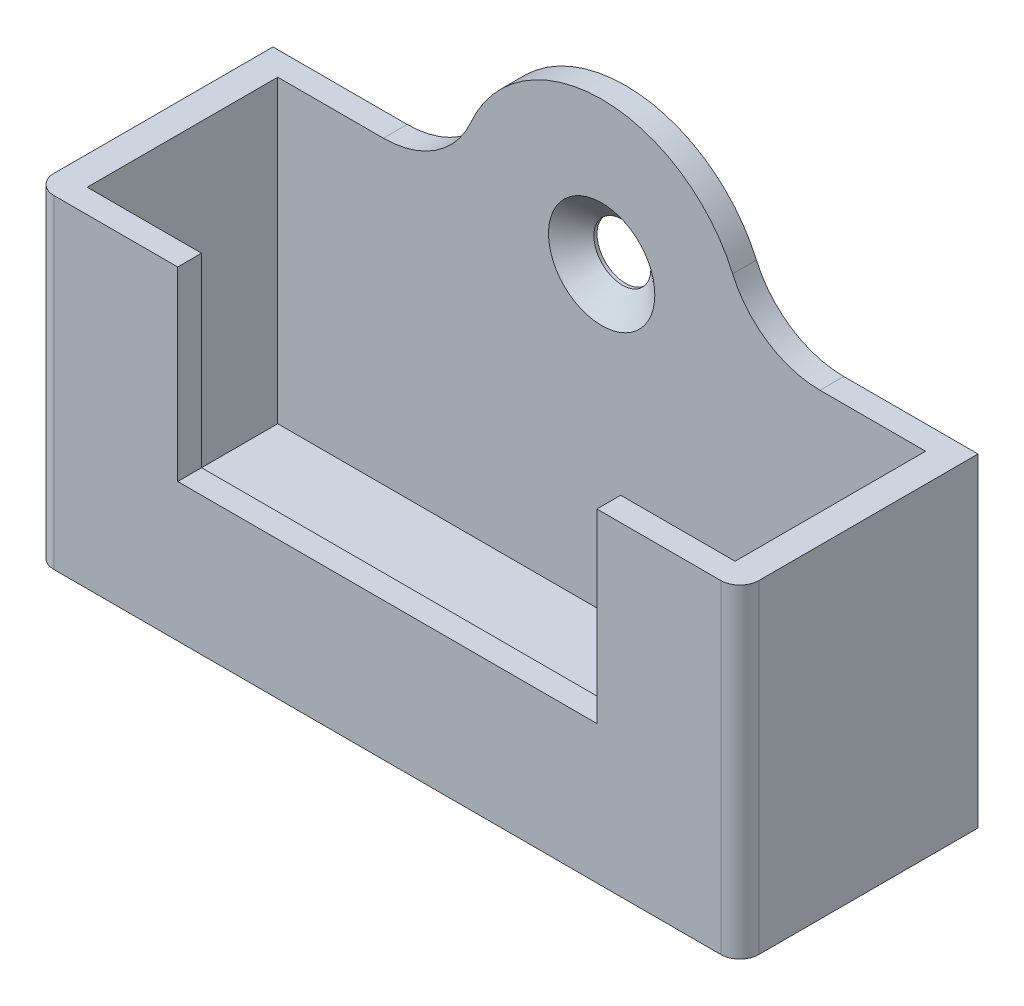
ISO-10303-21;
HEADER;
FILE_DESCRIPTION(('STEP AP214'),'2;1');
FILE_NAME('part.step','',(''),(''),'','','');
FILE_SCHEMA(('AUTOMOTIVE_DESIGN { 1 0 10303 214 1 1 1 1 }'));
ENDSEC;
DATA;
#1=APPLICATION_CONTEXT('core data for automotive mechanical design processes');
#2=APPLICATION_PROTOCOL_DEFINITION('international standard','automotive_design',2000,#1);
#3=PRODUCT_CONTEXT('',#1,'mechanical');
#4=PRODUCT('Part','Part','',(#3));
#5=PRODUCT_RELATED_PRODUCT_CATEGORY('part','',(#4));
#6=PRODUCT_DEFINITION_FORMATION('','',#4);
#7=PRODUCT_DEFINITION_CONTEXT('part definition',#1,'design');
#8=PRODUCT_DEFINITION('design','',#6,#7);
#9=PRODUCT_DEFINITION_SHAPE('','',#8);
#10=(LENGTH_UNIT() NAMED_UNIT(*) SI_UNIT(.MILLI.,.METRE.));
#11=(NAMED_UNIT(*) PLANE_ANGLE_UNIT() SI_UNIT($,.RADIAN.));
#12=(NAMED_UNIT(*) SI_UNIT($,.STERADIAN.) SOLID_ANGLE_UNIT());
#13=UNCERTAINTY_MEASURE_WITH_UNIT(LENGTH_MEASURE(1.E-05),#10,'distance_accuracy_value','');
#14=(GEOMETRIC_REPRESENTATION_CONTEXT(3) GLOBAL_UNCERTAINTY_ASSIGNED_CONTEXT((#13)) GLOBAL_UNIT_ASSIGNED_CONTEXT((#10,
#11,#12)) REPRESENTATION_CONTEXT('',''));
#15=CARTESIAN_POINT('',(0.,0.,0.));
#16=DIRECTION('',(0.,0.,1.));
#17=DIRECTION('',(1.,0.,0.));
#18=AXIS2_PLACEMENT_3D('',#15,#16,#17);
#19=CARTESIAN_POINT('',(13.97,-45.4823598359848,0.));
#20=DIRECTION('',(1.,0.,0.));
#21=DIRECTION('',(0.,0.,-1.));
#22=AXIS2_PLACEMENT_3D('',#19,#20,#21);
#23=PLANE('',#22);
#24=DIRECTION('',(0.,0.,-1.));
#25=VECTOR('',#24,1.);
#26=CARTESIAN_POINT('',(13.97,9.2075,7.9375));
#27=LINE('',#26,#25);
#28=CARTESIAN_POINT('',(13.97,9.2075,7.9375));
#29=VERTEX_POINT('',#28);
#30=CARTESIAN_POINT('',(13.97,9.2075,6.35));
#31=VERTEX_POINT('',#30);
#32=EDGE_CURVE('E56',#29,#31,#27,.T.);
#33=ORIENTED_EDGE('',*,*,#32,.F.);
#34=DIRECTION('',(0.,1.,0.));
#35=VECTOR('',#34,1.);
#36=CARTESIAN_POINT('',(13.97,-45.4823598359848,7.9375));
#37=LINE('',#36,#35);
#38=CARTESIAN_POINT('',(13.97,21.59,7.9375));
#39=VERTEX_POINT('',#38);
#40=EDGE_CURVE('E201',#29,#39,#37,.T.);
#41=ORIENTED_EDGE('',*,*,#40,.T.);
#42=DIRECTION('',(0.,0.,-1.));
#43=VECTOR('',#42,1.);
#44=CARTESIAN_POINT('',(13.97,21.59,0.));
#45=LINE('',#44,#43);
#46=CARTESIAN_POINT('',(13.97,21.59,6.35));
#47=VERTEX_POINT('',#46);
#48=EDGE_CURVE('E303',#39,#47,#45,.T.);
#49=ORIENTED_EDGE('',*,*,#48,.T.);
#50=DIRECTION('',(0.,1.,0.));
#51=VECTOR('',#50,1.);
#52=CARTESIAN_POINT('',(13.97,-45.4823598359848,6.35));
#53=LINE('',#52,#51);
#54=EDGE_CURVE('E52',#31,#47,#53,.T.);
#55=ORIENTED_EDGE('',*,*,#54,.F.);
#56=EDGE_LOOP('',(#33,#41,#49,#55));
#57=FACE_BOUND('',#56,.T.);
#58=ADVANCED_FACE('F37',(#57),#23,.F.);
#59=CARTESIAN_POINT('',(-13.97,-45.4823598359848,0.));
#60=DIRECTION('',(1.,0.,0.));
#61=DIRECTION('',(0.,0.,-1.));
#62=AXIS2_PLACEMENT_3D('',#59,#60,#61);
#63=PLANE('',#62);
#64=DIRECTION('',(0.,1.,0.));
#65=VECTOR('',#64,1.);
#66=CARTESIAN_POINT('',(-13.97,-45.4823598359848,7.9375));
#67=LINE('',#66,#65);
#68=CARTESIAN_POINT('',(-13.97,9.2075,7.9375));
#69=VERTEX_POINT('',#68);
#70=CARTESIAN_POINT('',(-13.97,21.59,7.9375));
#71=VERTEX_POINT('',#70);
#72=EDGE_CURVE('E203',#69,#71,#67,.T.);
#73=ORIENTED_EDGE('',*,*,#72,.F.);
#74=DIRECTION('',(0.,0.,1.));
#75=VECTOR('',#74,1.);
#76=CARTESIAN_POINT('',(-13.97,9.2075,7.9375));
#77=LINE('',#76,#75);
#78=CARTESIAN_POINT('',(-13.97,9.2075,6.35));
#79=VERTEX_POINT('',#78);
#80=EDGE_CURVE('E312',#79,#69,#77,.T.);
#81=ORIENTED_EDGE('',*,*,#80,.F.);
#82=DIRECTION('',(0.,1.,0.));
#83=VECTOR('',#82,1.);
#84=CARTESIAN_POINT('',(-13.97,-45.4823598359848,6.35));
#85=LINE('',#84,#83);
#86=CARTESIAN_POINT('',(-13.97,21.59,6.35));
#87=VERTEX_POINT('',#86);
#88=EDGE_CURVE('E178',#79,#87,#85,.T.);
#89=ORIENTED_EDGE('',*,*,#88,.T.);
#90=DIRECTION('',(0.,0.,-1.));
#91=VECTOR('',#90,1.);
#92=CARTESIAN_POINT('',(-13.97,21.59,0.));
#93=LINE('',#92,#91);
#94=EDGE_CURVE('E204',#71,#87,#93,.T.);
#95=ORIENTED_EDGE('',*,*,#94,.F.);
#96=EDGE_LOOP('',(#73,#81,#89,#95));
#97=FACE_BOUND('',#96,.T.);
#98=ADVANCED_FACE('F352',(#97),#63,.T.);
#99=CARTESIAN_POINT('',(0.,1.5875,0.));
#100=DIRECTION('',(0.,-1.,0.));
#101=DIRECTION('',(0.,0.,-1.));
#102=AXIS2_PLACEMENT_3D('',#99,#100,#101);
#103=PLANE('',#102);
#104=DIRECTION('',(1.,0.,0.));
#105=VECTOR('',#104,1.);
#106=CARTESIAN_POINT('',(0.,1.5875,6.35));
#107=LINE('',#106,#105);
#108=CARTESIAN_POINT('',(-21.59,1.5875,6.35));
#109=VERTEX_POINT('',#108);
#110=CARTESIAN_POINT('',(21.59,1.5875,6.35));
#111=VERTEX_POINT('',#110);
#112=EDGE_CURVE('E162',#109,#111,#107,.T.);
#113=ORIENTED_EDGE('',*,*,#112,.T.);
#114=DIRECTION('',(0.,0.,-1.));
#115=VECTOR('',#114,1.);
#116=CARTESIAN_POINT('',(21.59,1.5875,0.));
#117=LINE('',#116,#115);
#118=CARTESIAN_POINT('',(21.59,1.5875,-6.35));
#119=VERTEX_POINT('',#118);
#120=EDGE_CURVE('E198',#111,#119,#117,.T.);
#121=ORIENTED_EDGE('',*,*,#120,.T.);
#122=DIRECTION('',(1.,0.,0.));
#123=VECTOR('',#122,1.);
#124=CARTESIAN_POINT('',(0.,1.5875,-6.35));
#125=LINE('',#124,#123);
#126=CARTESIAN_POINT('',(-21.59,1.5875,-6.35));
#127=VERTEX_POINT('',#126);
#128=EDGE_CURVE('E165',#127,#119,#125,.T.);
#129=ORIENTED_EDGE('',*,*,#128,.F.);
#130=DIRECTION('',(0.,0.,-1.));
#131=VECTOR('',#130,1.);
#132=CARTESIAN_POINT('',(-21.59,1.5875,0.));
#133=LINE('',#132,#131);
#134=EDGE_CURVE('E158',#109,#127,#133,.T.);
#135=ORIENTED_EDGE('',*,*,#134,.F.);
#136=EDGE_LOOP('',(#113,#121,#129,#135));
#137=FACE_BOUND('',#136,.T.);
#138=ADVANCED_FACE('F160',(#137),#103,.F.);
#139=CARTESIAN_POINT('',(0.,21.59,0.));
#140=DIRECTION('',(0.,-1.,0.));
#141=DIRECTION('',(0.,0.,-1.));
#142=AXIS2_PLACEMENT_3D('',#139,#140,#141);
#143=PLANE('',#142);
#144=DIRECTION('',(1.,0.,0.));
#145=VECTOR('',#144,1.);
#146=CARTESIAN_POINT('',(23.495,21.59,7.93749999999999));
#147=LINE('',#146,#145);
#148=CARTESIAN_POINT('',(22.225,21.59,7.93749999999999));
#149=VERTEX_POINT('',#148);
#150=EDGE_CURVE('E209',#39,#149,#147,.T.);
#151=ORIENTED_EDGE('',*,*,#150,.T.);
#152=CARTESIAN_POINT('',(22.225,21.59,6.66749999999999));
#153=DIRECTION('',(0.,-1.,0.));
#154=DIRECTION('',(0.,0.,-1.));
#155=AXIS2_PLACEMENT_3D('',#152,#153,#154);
#156=CIRCLE('',#155,1.27);
#157=CARTESIAN_POINT('',(23.495,21.59,6.66749999999999));
#158=VERTEX_POINT('',#157);
#159=EDGE_CURVE('E265',#149,#158,#156,.F.);
#160=ORIENTED_EDGE('',*,*,#159,.T.);
#161=DIRECTION('',(0.,0.,-1.));
#162=VECTOR('',#161,1.);
#163=CARTESIAN_POINT('',(23.495,21.59,-7.93750000000001));
#164=LINE('',#163,#162);
#165=CARTESIAN_POINT('',(23.495,21.59,-7.93750000000001));
#166=VERTEX_POINT('',#165);
#167=EDGE_CURVE('E214',#158,#166,#164,.T.);
#168=ORIENTED_EDGE('',*,*,#167,.T.);
#169=DIRECTION('',(-1.,0.,0.));
#170=VECTOR('',#169,1.);
#171=CARTESIAN_POINT('',(23.495,21.59,-7.93750000000001));
#172=LINE('',#171,#170);
#173=CARTESIAN_POINT('',(14.5496778314848,21.59,-7.93750000000001));
#174=VERTEX_POINT('',#173);
#175=EDGE_CURVE('E217',#166,#174,#172,.T.);
#176=ORIENTED_EDGE('',*,*,#175,.T.);
#177=DIRECTION('',(0.,0.,1.));
#178=VECTOR('',#177,1.);
#179=CARTESIAN_POINT('',(14.5496778314848,21.59,0.));
#180=LINE('',#179,#178);
#181=CARTESIAN_POINT('',(14.5496778314848,21.59,-6.35));
#182=VERTEX_POINT('',#181);
#183=EDGE_CURVE('E235',#174,#182,#180,.T.);
#184=ORIENTED_EDGE('',*,*,#183,.T.);
#185=DIRECTION('',(1.,0.,0.));
#186=VECTOR('',#185,1.);
#187=CARTESIAN_POINT('',(0.,21.59,-6.35));
#188=LINE('',#187,#186);
#189=CARTESIAN_POINT('',(21.59,21.59,-6.35));
#190=VERTEX_POINT('',#189);
#191=EDGE_CURVE('E194',#182,#190,#188,.T.);
#192=ORIENTED_EDGE('',*,*,#191,.T.);
#193=DIRECTION('',(0.,0.,-1.));
#194=VECTOR('',#193,1.);
#195=CARTESIAN_POINT('',(21.59,21.59,0.));
#196=LINE('',#195,#194);
#197=CARTESIAN_POINT('',(21.59,21.59,6.35));
#198=VERTEX_POINT('',#197);
#199=EDGE_CURVE('E168',#198,#190,#196,.T.);
#200=ORIENTED_EDGE('',*,*,#199,.F.);
#201=DIRECTION('',(1.,0.,0.));
#202=VECTOR('',#201,1.);
#203=CARTESIAN_POINT('',(0.,21.59,6.35));
#204=LINE('',#203,#202);
#205=EDGE_CURVE('E336',#47,#198,#204,.T.);
#206=ORIENTED_EDGE('',*,*,#205,.F.);
#207=ORIENTED_EDGE('',*,*,#48,.F.);
#208=EDGE_LOOP('',(#151,#160,#168,#176,#184,#192,#200,#206,#207));
#209=FACE_BOUND('',#208,.T.);
#210=ADVANCED_FACE('F298',(#209),#143,.F.);
#211=CARTESIAN_POINT('',(-23.495,21.59,-7.9375));
#212=DIRECTION('',(1.,0.,0.));
#213=DIRECTION('',(0.,0.,-1.));
#214=AXIS2_PLACEMENT_3D('',#211,#212,#213);
#215=PLANE('',#214);
#216=DIRECTION('',(0.,0.,1.));
#217=VECTOR('',#216,1.);
#218=CARTESIAN_POINT('',(-23.495,0.,-7.9375));
#219=LINE('',#218,#217);
#220=CARTESIAN_POINT('',(-23.495,0.,-7.9375));
#221=VERTEX_POINT('',#220);
#222=CARTESIAN_POINT('',(-23.495,0.,6.6675));
#223=VERTEX_POINT('',#222);
#224=EDGE_CURVE('E221',#221,#223,#219,.T.);
#225=ORIENTED_EDGE('',*,*,#224,.T.);
#226=DIRECTION('',(0.,-1.,0.));
#227=VECTOR('',#226,1.);
#228=CARTESIAN_POINT('',(-23.495,21.59,6.6675));
#229=LINE('',#228,#227);
#230=CARTESIAN_POINT('',(-23.495,21.59,6.6675));
#231=VERTEX_POINT('',#230);
#232=EDGE_CURVE('E45',#223,#231,#229,.F.);
#233=ORIENTED_EDGE('',*,*,#232,.T.);
#234=DIRECTION('',(0.,0.,1.));
#235=VECTOR('',#234,1.);
#236=CARTESIAN_POINT('',(-23.495,21.59,-7.9375));
#237=LINE('',#236,#235);
#238=CARTESIAN_POINT('',(-23.495,21.59,-7.9375));
#239=VERTEX_POINT('',#238);
#240=EDGE_CURVE('E206',#239,#231,#237,.T.);
#241=ORIENTED_EDGE('',*,*,#240,.F.);
#242=DIRECTION('',(0.,-1.,0.));
#243=VECTOR('',#242,1.);
#244=CARTESIAN_POINT('',(-23.495,21.59,-7.9375));
#245=LINE('',#244,#243);
#246=EDGE_CURVE('E220',#239,#221,#245,.T.);
#247=ORIENTED_EDGE('',*,*,#246,.T.);
#248=EDGE_LOOP('',(#225,#233,#241,#247));
#249=FACE_BOUND('',#248,.T.);
#250=ADVANCED_FACE('F269',(#249),#215,.F.);
#251=CARTESIAN_POINT('',(23.495,21.59,7.93749999999999));
#252=DIRECTION('',(0.,0.,-1.));
#253=DIRECTION('',(-1.,0.,0.));
#254=AXIS2_PLACEMENT_3D('',#251,#252,#253);
#255=PLANE('',#254);
#256=ORIENTED_EDGE('',*,*,#40,.F.);
#257=DIRECTION('',(1.,0.,0.));
#258=VECTOR('',#257,1.);
#259=CARTESIAN_POINT('',(-13.97,9.2075,7.9375));
#260=LINE('',#259,#258);
#261=EDGE_CURVE('E306',#69,#29,#260,.T.);
#262=ORIENTED_EDGE('',*,*,#261,.F.);
#263=ORIENTED_EDGE('',*,*,#72,.T.);
#264=CARTESIAN_POINT('',(-22.225,21.59,7.9375));
#265=VERTEX_POINT('',#264);
#266=EDGE_CURVE('E211',#265,#71,#147,.T.);
#267=ORIENTED_EDGE('',*,*,#266,.F.);
#268=DIRECTION('',(0.,-1.,0.));
#269=VECTOR('',#268,1.);
#270=CARTESIAN_POINT('',(-22.225,21.59,7.9375));
#271=LINE('',#270,#269);
#272=CARTESIAN_POINT('',(-22.225,0.,7.9375));
#273=VERTEX_POINT('',#272);
#274=EDGE_CURVE('E260',#265,#273,#271,.T.);
#275=ORIENTED_EDGE('',*,*,#274,.T.);
#276=DIRECTION('',(1.,0.,0.));
#277=VECTOR('',#276,1.);
#278=CARTESIAN_POINT('',(23.495,0.,7.93749999999999));
#279=LINE('',#278,#277);
#280=CARTESIAN_POINT('',(22.225,0.,7.93749999999999));
#281=VERTEX_POINT('',#280);
#282=EDGE_CURVE('E224',#273,#281,#279,.T.);
#283=ORIENTED_EDGE('',*,*,#282,.T.);
#284=DIRECTION('',(0.,-1.,0.));
#285=VECTOR('',#284,1.);
#286=CARTESIAN_POINT('',(22.225,21.59,7.93749999999999));
#287=LINE('',#286,#285);
#288=EDGE_CURVE('E263',#281,#149,#287,.F.);
#289=ORIENTED_EDGE('',*,*,#288,.T.);
#290=ORIENTED_EDGE('',*,*,#150,.F.);
#291=EDGE_LOOP('',(#256,#262,#263,#267,#275,#283,#289,#290));
#292=FACE_BOUND('',#291,.T.);
#293=ADVANCED_FACE('F281',(#292),#255,.F.);
#294=CARTESIAN_POINT('',(23.495,21.59,-7.93750000000001));
#295=DIRECTION('',(-1.,0.,0.));
#296=DIRECTION('',(0.,0.,1.));
#297=AXIS2_PLACEMENT_3D('',#294,#295,#296);
#298=PLANE('',#297);
#299=ORIENTED_EDGE('',*,*,#167,.F.);
#300=DIRECTION('',(0.,-1.,0.));
#301=VECTOR('',#300,1.);
#302=CARTESIAN_POINT('',(23.495,21.59,6.66749999999999));
#303=LINE('',#302,#301);
#304=CARTESIAN_POINT('',(23.495,0.,6.66749999999999));
#305=VERTEX_POINT('',#304);
#306=EDGE_CURVE('E253',#158,#305,#303,.T.);
#307=ORIENTED_EDGE('',*,*,#306,.T.);
#308=DIRECTION('',(0.,0.,-1.));
#309=VECTOR('',#308,1.);
#310=CARTESIAN_POINT('',(23.495,0.,-7.93750000000001));
#311=LINE('',#310,#309);
#312=CARTESIAN_POINT('',(23.495,0.,-7.93750000000001));
#313=VERTEX_POINT('',#312);
#314=EDGE_CURVE('E227',#305,#313,#311,.T.);
#315=ORIENTED_EDGE('',*,*,#314,.T.);
#316=DIRECTION('',(0.,-1.,0.));
#317=VECTOR('',#316,1.);
#318=CARTESIAN_POINT('',(23.495,21.59,-7.93750000000001));
#319=LINE('',#318,#317);
#320=EDGE_CURVE('E232',#166,#313,#319,.T.);
#321=ORIENTED_EDGE('',*,*,#320,.F.);
#322=EDGE_LOOP('',(#299,#307,#315,#321));
#323=FACE_BOUND('',#322,.T.);
#324=ADVANCED_FACE('F293',(#323),#298,.F.);
#325=CARTESIAN_POINT('',(23.495,21.59,-7.93750000000001));
#326=DIRECTION('',(0.,0.,1.));
#327=DIRECTION('',(1.,0.,0.));
#328=AXIS2_PLACEMENT_3D('',#325,#326,#327);
#329=PLANE('',#328);
#330=CARTESIAN_POINT('',(0.,21.59,-7.93750000000001));
#331=DIRECTION('',(0.,0.,1.));
#332=DIRECTION('',(1.,0.,0.));
#333=AXIS2_PLACEMENT_3D('',#330,#331,#332);
#334=CIRCLE('',#333,1.89865);
#335=CARTESIAN_POINT('',(1.89864999999999,21.59,-7.93750000000001));
#336=VERTEX_POINT('',#335);
#337=EDGE_CURVE('E325',#336,#336,#334,.T.);
#338=ORIENTED_EDGE('',*,*,#337,.T.);
#339=EDGE_LOOP('',(#338));
#340=FACE_BOUND('',#339,.T.);
#341=CARTESIAN_POINT('',(-14.5496778314848,21.59,-7.9375));
#342=VERTEX_POINT('',#341);
#343=EDGE_CURVE('E216',#342,#239,#172,.T.);
#344=ORIENTED_EDGE('',*,*,#343,.F.);
#345=CARTESIAN_POINT('',(-14.5496778314848,27.94,-7.9375));
#346=DIRECTION('',(0.,0.,1.));
#347=DIRECTION('',(1.,0.,0.));
#348=AXIS2_PLACEMENT_3D('',#345,#346,#347);
#349=CIRCLE('',#348,6.35);
#350=CARTESIAN_POINT('',(-8.72980669889089,25.4,-7.9375));
#351=VERTEX_POINT('',#350);
#352=EDGE_CURVE('E249',#342,#351,#349,.T.);
#353=ORIENTED_EDGE('',*,*,#352,.T.);
#354=CARTESIAN_POINT('',(0.,21.59,-7.9375));
#355=DIRECTION('',(0.,0.,1.));
#356=DIRECTION('',(1.,0.,0.));
#357=AXIS2_PLACEMENT_3D('',#354,#355,#356);
#358=CIRCLE('',#357,9.525);
#359=CARTESIAN_POINT('',(8.72980669889087,25.4,-7.9375));
#360=VERTEX_POINT('',#359);
#361=EDGE_CURVE('E184',#351,#360,#358,.F.);
#362=ORIENTED_EDGE('',*,*,#361,.T.);
#363=CARTESIAN_POINT('',(14.5496778314848,27.94,-7.93750000000001));
#364=DIRECTION('',(0.,0.,1.));
#365=DIRECTION('',(1.,0.,0.));
#366=AXIS2_PLACEMENT_3D('',#363,#364,#365);
#367=CIRCLE('',#366,6.35);
#368=EDGE_CURVE('E247',#360,#174,#367,.T.);
#369=ORIENTED_EDGE('',*,*,#368,.T.);
#370=ORIENTED_EDGE('',*,*,#175,.F.);
#371=ORIENTED_EDGE('',*,*,#320,.T.);
#372=DIRECTION('',(-1.,0.,0.));
#373=VECTOR('',#372,1.);
#374=CARTESIAN_POINT('',(23.495,0.,-7.93750000000001));
#375=LINE('',#374,#373);
#376=EDGE_CURVE('E210',#313,#221,#375,.T.);
#377=ORIENTED_EDGE('',*,*,#376,.T.);
#378=ORIENTED_EDGE('',*,*,#246,.F.);
#379=EDGE_LOOP('',(#344,#353,#362,#369,#370,#371,#377,#378));
#380=FACE_BOUND('',#379,.T.);
#381=ADVANCED_FACE('F378',(#340,#380),#329,.F.);
#382=ORIENTED_EDGE('',*,*,#240,.T.);
#383=CARTESIAN_POINT('',(-22.225,21.59,6.6675));
#384=DIRECTION('',(0.,-1.,0.));
#385=DIRECTION('',(0.,0.,-1.));
#386=AXIS2_PLACEMENT_3D('',#383,#384,#385);
#387=CIRCLE('',#386,1.27);
#388=EDGE_CURVE('E12',#231,#265,#387,.F.);
#389=ORIENTED_EDGE('',*,*,#388,.T.);
#390=ORIENTED_EDGE('',*,*,#266,.T.);
#391=ORIENTED_EDGE('',*,*,#94,.T.);
#392=CARTESIAN_POINT('',(-21.59,21.59,6.35));
#393=VERTEX_POINT('',#392);
#394=EDGE_CURVE('E338',#393,#87,#204,.T.);
#395=ORIENTED_EDGE('',*,*,#394,.F.);
#396=DIRECTION('',(0.,0.,-1.));
#397=VECTOR('',#396,1.);
#398=CARTESIAN_POINT('',(-21.59,21.59,0.));
#399=LINE('',#398,#397);
#400=CARTESIAN_POINT('',(-21.59,21.59,-6.35));
#401=VERTEX_POINT('',#400);
#402=EDGE_CURVE('E174',#393,#401,#399,.T.);
#403=ORIENTED_EDGE('',*,*,#402,.T.);
#404=CARTESIAN_POINT('',(-14.5496778314848,21.59,-6.35));
#405=VERTEX_POINT('',#404);
#406=EDGE_CURVE('E331',#401,#405,#188,.T.);
#407=ORIENTED_EDGE('',*,*,#406,.T.);
#408=DIRECTION('',(0.,0.,1.));
#409=VECTOR('',#408,1.);
#410=CARTESIAN_POINT('',(-14.5496778314848,21.59,0.));
#411=LINE('',#410,#409);
#412=EDGE_CURVE('E242',#405,#342,#411,.F.);
#413=ORIENTED_EDGE('',*,*,#412,.T.);
#414=ORIENTED_EDGE('',*,*,#343,.T.);
#415=EDGE_LOOP('',(#382,#389,#390,#391,#395,#403,#407,#413,#414));
#416=FACE_BOUND('',#415,.T.);
#417=ADVANCED_FACE('F274',(#416),#143,.F.);
#418=CARTESIAN_POINT('',(0.,0.,0.));
#419=DIRECTION('',(0.,-1.,0.));
#420=DIRECTION('',(0.,0.,-1.));
#421=AXIS2_PLACEMENT_3D('',#418,#419,#420);
#422=PLANE('',#421);
#423=ORIENTED_EDGE('',*,*,#314,.F.);
#424=CARTESIAN_POINT('',(22.225,0.,6.66749999999999));
#425=DIRECTION('',(0.,-1.,0.));
#426=DIRECTION('',(0.,0.,-1.));
#427=AXIS2_PLACEMENT_3D('',#424,#425,#426);
#428=CIRCLE('',#427,1.27);
#429=EDGE_CURVE('E258',#305,#281,#428,.T.);
#430=ORIENTED_EDGE('',*,*,#429,.T.);
#431=ORIENTED_EDGE('',*,*,#282,.F.);
#432=CARTESIAN_POINT('',(-22.225,0.,6.6675));
#433=DIRECTION('',(0.,-1.,0.));
#434=DIRECTION('',(0.,0.,-1.));
#435=AXIS2_PLACEMENT_3D('',#432,#433,#434);
#436=CIRCLE('',#435,1.27);
#437=EDGE_CURVE('E256',#273,#223,#436,.T.);
#438=ORIENTED_EDGE('',*,*,#437,.T.);
#439=ORIENTED_EDGE('',*,*,#224,.F.);
#440=ORIENTED_EDGE('',*,*,#376,.F.);
#441=EDGE_LOOP('',(#423,#430,#431,#438,#439,#440));
#442=FACE_BOUND('',#441,.T.);
#443=ADVANCED_FACE('F285',(#442),#422,.T.);
#444=CARTESIAN_POINT('',(0.,-45.4823598359848,6.35));
#445=DIRECTION('',(0.,0.,1.));
#446=DIRECTION('',(1.,0.,0.));
#447=AXIS2_PLACEMENT_3D('',#444,#445,#446);
#448=PLANE('',#447);
#449=DIRECTION('',(0.,1.,0.));
#450=VECTOR('',#449,1.);
#451=CARTESIAN_POINT('',(-21.59,-45.4823598359848,6.35));
#452=LINE('',#451,#450);
#453=EDGE_CURVE('E171',#109,#393,#452,.T.);
#454=ORIENTED_EDGE('',*,*,#453,.T.);
#455=ORIENTED_EDGE('',*,*,#394,.T.);
#456=ORIENTED_EDGE('',*,*,#88,.F.);
#457=DIRECTION('',(-1.,0.,0.));
#458=VECTOR('',#457,1.);
#459=CARTESIAN_POINT('',(-13.97,9.2075,6.35));
#460=LINE('',#459,#458);
#461=EDGE_CURVE('E314',#31,#79,#460,.T.);
#462=ORIENTED_EDGE('',*,*,#461,.F.);
#463=ORIENTED_EDGE('',*,*,#54,.T.);
#464=ORIENTED_EDGE('',*,*,#205,.T.);
#465=DIRECTION('',(0.,1.,0.));
#466=VECTOR('',#465,1.);
#467=CARTESIAN_POINT('',(21.59,-45.4823598359848,6.35));
#468=LINE('',#467,#466);
#469=EDGE_CURVE('E182',#111,#198,#468,.T.);
#470=ORIENTED_EDGE('',*,*,#469,.F.);
#471=ORIENTED_EDGE('',*,*,#112,.F.);
#472=EDGE_LOOP('',(#454,#455,#456,#462,#463,#464,#470,#471));
#473=FACE_BOUND('',#472,.T.);
#474=ADVANCED_FACE('F180',(#473),#448,.F.);
#475=CARTESIAN_POINT('',(-21.59,-45.4823598359848,0.));
#476=DIRECTION('',(1.,0.,0.));
#477=DIRECTION('',(0.,0.,-1.));
#478=AXIS2_PLACEMENT_3D('',#475,#476,#477);
#479=PLANE('',#478);
#480=ORIENTED_EDGE('',*,*,#134,.T.);
#481=DIRECTION('',(0.,1.,0.));
#482=VECTOR('',#481,1.);
#483=CARTESIAN_POINT('',(-21.59,-45.4823598359848,-6.35));
#484=LINE('',#483,#482);
#485=EDGE_CURVE('E192',#127,#401,#484,.T.);
#486=ORIENTED_EDGE('',*,*,#485,.T.);
#487=ORIENTED_EDGE('',*,*,#402,.F.);
#488=ORIENTED_EDGE('',*,*,#453,.F.);
#489=EDGE_LOOP('',(#480,#486,#487,#488));
#490=FACE_BOUND('',#489,.T.);
#491=ADVANCED_FACE('F172',(#490),#479,.T.);
#492=CARTESIAN_POINT('',(0.,-45.4823598359848,-6.35));
#493=DIRECTION('',(0.,0.,1.));
#494=DIRECTION('',(1.,0.,0.));
#495=AXIS2_PLACEMENT_3D('',#492,#493,#494);
#496=PLANE('',#495);
#497=CARTESIAN_POINT('',(0.,21.59,-6.35));
#498=DIRECTION('',(0.,0.,1.));
#499=DIRECTION('',(1.,0.,0.));
#500=AXIS2_PLACEMENT_3D('',#497,#498,#499);
#501=CIRCLE('',#500,3.5433);
#502=CARTESIAN_POINT('',(3.54329999999999,21.59,-6.35));
#503=VERTEX_POINT('',#502);
#504=EDGE_CURVE('E319',#503,#503,#501,.T.);
#505=ORIENTED_EDGE('',*,*,#504,.F.);
#506=EDGE_LOOP('',(#505));
#507=FACE_BOUND('',#506,.T.);
#508=ORIENTED_EDGE('',*,*,#191,.F.);
#509=CARTESIAN_POINT('',(14.5496778314848,27.94,-6.35));
#510=DIRECTION('',(0.,0.,1.));
#511=DIRECTION('',(1.,0.,0.));
#512=AXIS2_PLACEMENT_3D('',#509,#510,#511);
#513=CIRCLE('',#512,6.35);
#514=CARTESIAN_POINT('',(8.72980669889087,25.4,-6.35));
#515=VERTEX_POINT('',#514);
#516=EDGE_CURVE('E245',#182,#515,#513,.F.);
#517=ORIENTED_EDGE('',*,*,#516,.T.);
#518=CARTESIAN_POINT('',(0.,21.59,-6.35));
#519=DIRECTION('',(0.,0.,1.));
#520=DIRECTION('',(1.,0.,0.));
#521=AXIS2_PLACEMENT_3D('',#518,#519,#520);
#522=CIRCLE('',#521,9.525);
#523=CARTESIAN_POINT('',(-8.72980669889089,25.4,-6.35));
#524=VERTEX_POINT('',#523);
#525=EDGE_CURVE('E188',#515,#524,#522,.T.);
#526=ORIENTED_EDGE('',*,*,#525,.T.);
#527=CARTESIAN_POINT('',(-14.5496778314848,27.94,-6.35));
#528=DIRECTION('',(0.,0.,1.));
#529=DIRECTION('',(1.,0.,0.));
#530=AXIS2_PLACEMENT_3D('',#527,#528,#529);
#531=CIRCLE('',#530,6.35);
#532=EDGE_CURVE('E251',#524,#405,#531,.F.);
#533=ORIENTED_EDGE('',*,*,#532,.T.);
#534=ORIENTED_EDGE('',*,*,#406,.F.);
#535=ORIENTED_EDGE('',*,*,#485,.F.);
#536=ORIENTED_EDGE('',*,*,#128,.T.);
#537=DIRECTION('',(0.,1.,0.));
#538=VECTOR('',#537,1.);
#539=CARTESIAN_POINT('',(21.59,-45.4823598359848,-6.35));
#540=LINE('',#539,#538);
#541=EDGE_CURVE('E195',#119,#190,#540,.T.);
#542=ORIENTED_EDGE('',*,*,#541,.T.);
#543=EDGE_LOOP('',(#508,#517,#526,#533,#534,#535,#536,#542));
#544=FACE_BOUND('',#543,.T.);
#545=ADVANCED_FACE('F344',(#507,#544),#496,.T.);
#546=CARTESIAN_POINT('',(21.59,-45.4823598359848,0.));
#547=DIRECTION('',(1.,0.,0.));
#548=DIRECTION('',(0.,0.,-1.));
#549=AXIS2_PLACEMENT_3D('',#546,#547,#548);
#550=PLANE('',#549);
#551=ORIENTED_EDGE('',*,*,#469,.T.);
#552=ORIENTED_EDGE('',*,*,#199,.T.);
#553=ORIENTED_EDGE('',*,*,#541,.F.);
#554=ORIENTED_EDGE('',*,*,#120,.F.);
#555=EDGE_LOOP('',(#551,#552,#553,#554));
#556=FACE_BOUND('',#555,.T.);
#557=ADVANCED_FACE('F367',(#556),#550,.F.);
#558=CARTESIAN_POINT('',(0.,21.59,-34.8782683632075));
#559=DIRECTION('',(0.,0.,1.));
#560=DIRECTION('',(1.,0.,0.));
#561=AXIS2_PLACEMENT_3D('',#558,#559,#560);
#562=CYLINDRICAL_SURFACE('',#561,9.525);
#563=ORIENTED_EDGE('',*,*,#525,.F.);
#564=DIRECTION('',(0.,0.,1.));
#565=VECTOR('',#564,1.);
#566=CARTESIAN_POINT('',(8.72980669889087,25.4,-34.8782683632075));
#567=LINE('',#566,#565);
#568=EDGE_CURVE('E240',#515,#360,#567,.F.);
#569=ORIENTED_EDGE('',*,*,#568,.T.);
#570=ORIENTED_EDGE('',*,*,#361,.F.);
#571=DIRECTION('',(0.,0.,1.));
#572=VECTOR('',#571,1.);
#573=CARTESIAN_POINT('',(-8.72980669889089,25.4,-34.8782683632075));
#574=LINE('',#573,#572);
#575=EDGE_CURVE('E238',#351,#524,#574,.T.);
#576=ORIENTED_EDGE('',*,*,#575,.T.);
#577=EDGE_LOOP('',(#563,#569,#570,#576));
#578=FACE_BOUND('',#577,.T.);
#579=ADVANCED_FACE('F362',(#578),#562,.T.);
#580=CARTESIAN_POINT('',(0.,21.59,-6.35));
#581=DIRECTION('',(0.,0.,1.));
#582=DIRECTION('',(1.,0.,0.));
#583=AXIS2_PLACEMENT_3D('',#580,#581,#582);
#584=CYLINDRICAL_SURFACE('',#583,1.89865);
#585=ORIENTED_EDGE('',*,*,#337,.F.);
#586=EDGE_LOOP('',(#585));
#587=FACE_BOUND('',#586,.T.);
#588=CARTESIAN_POINT('',(0.,21.59,-7.73002520841571));
#589=DIRECTION('',(0.,0.,1.));
#590=DIRECTION('',(1.,0.,0.));
#591=AXIS2_PLACEMENT_3D('',#588,#589,#590);
#592=CIRCLE('',#591,1.89865);
#593=CARTESIAN_POINT('',(1.89864999999999,21.59,-7.73002520841571));
#594=VERTEX_POINT('',#593);
#595=EDGE_CURVE('E322',#594,#594,#592,.T.);
#596=ORIENTED_EDGE('',*,*,#595,.T.);
#597=EDGE_LOOP('',(#596));
#598=FACE_BOUND('',#597,.T.);
#599=ADVANCED_FACE('F410',(#587,#598),#584,.F.);
#600=CARTESIAN_POINT('',(0.,21.59,-6.35));
#601=DIRECTION('',(0.,0.,1.));
#602=DIRECTION('',(1.,0.,0.));
#603=AXIS2_PLACEMENT_3D('',#600,#601,#602);
#604=CONICAL_SURFACE('',#603,3.5433,0.872664625997165);
#605=ORIENTED_EDGE('',*,*,#595,.F.);
#606=EDGE_LOOP('',(#605));
#607=FACE_BOUND('',#606,.T.);
#608=ORIENTED_EDGE('',*,*,#504,.T.);
#609=EDGE_LOOP('',(#608));
#610=FACE_BOUND('',#609,.T.);
#611=ADVANCED_FACE('F394',(#607,#610),#604,.F.);
#612=CARTESIAN_POINT('',(14.5496778314848,27.94,-34.8782683632075));
#613=DIRECTION('',(0.,0.,1.));
#614=DIRECTION('',(1.,0.,0.));
#615=AXIS2_PLACEMENT_3D('',#612,#613,#614);
#616=CYLINDRICAL_SURFACE('',#615,6.35);
#617=ORIENTED_EDGE('',*,*,#368,.F.);
#618=ORIENTED_EDGE('',*,*,#568,.F.);
#619=ORIENTED_EDGE('',*,*,#516,.F.);
#620=ORIENTED_EDGE('',*,*,#183,.F.);
#621=EDGE_LOOP('',(#617,#618,#619,#620));
#622=FACE_BOUND('',#621,.T.);
#623=ADVANCED_FACE('F390',(#622),#616,.F.);
#624=CARTESIAN_POINT('',(-14.5496778314848,27.94,-34.8782683632075));
#625=DIRECTION('',(0.,0.,1.));
#626=DIRECTION('',(1.,0.,0.));
#627=AXIS2_PLACEMENT_3D('',#624,#625,#626);
#628=CYLINDRICAL_SURFACE('',#627,6.35);
#629=ORIENTED_EDGE('',*,*,#532,.F.);
#630=ORIENTED_EDGE('',*,*,#575,.F.);
#631=ORIENTED_EDGE('',*,*,#352,.F.);
#632=ORIENTED_EDGE('',*,*,#412,.F.);
#633=EDGE_LOOP('',(#629,#630,#631,#632));
#634=FACE_BOUND('',#633,.T.);
#635=ADVANCED_FACE('F393',(#634),#628,.F.);
#636=CARTESIAN_POINT('',(22.225,21.59,6.66749999999999));
#637=DIRECTION('',(0.,-1.,0.));
#638=DIRECTION('',(0.,0.,-1.));
#639=AXIS2_PLACEMENT_3D('',#636,#637,#638);
#640=CYLINDRICAL_SURFACE('',#639,1.27);
#641=ORIENTED_EDGE('',*,*,#159,.F.);
#642=ORIENTED_EDGE('',*,*,#288,.F.);
#643=ORIENTED_EDGE('',*,*,#429,.F.);
#644=ORIENTED_EDGE('',*,*,#306,.F.);
#645=EDGE_LOOP('',(#641,#642,#643,#644));
#646=FACE_BOUND('',#645,.T.);
#647=ADVANCED_FACE('F290',(#646),#640,.T.);
#648=CARTESIAN_POINT('',(-22.225,21.59,6.6675));
#649=DIRECTION('',(0.,-1.,0.));
#650=DIRECTION('',(0.,0.,-1.));
#651=AXIS2_PLACEMENT_3D('',#648,#649,#650);
#652=CYLINDRICAL_SURFACE('',#651,1.27);
#653=ORIENTED_EDGE('',*,*,#388,.F.);
#654=ORIENTED_EDGE('',*,*,#232,.F.);
#655=ORIENTED_EDGE('',*,*,#437,.F.);
#656=ORIENTED_EDGE('',*,*,#274,.F.);
#657=EDGE_LOOP('',(#653,#654,#655,#656));
#658=FACE_BOUND('',#657,.T.);
#659=ADVANCED_FACE('F39',(#658),#652,.T.);
#660=CARTESIAN_POINT('',(0.,9.2075,0.));
#661=DIRECTION('',(0.,-1.,0.));
#662=DIRECTION('',(0.,0.,-1.));
#663=AXIS2_PLACEMENT_3D('',#660,#661,#662);
#664=PLANE('',#663);
#665=ORIENTED_EDGE('',*,*,#80,.T.);
#666=ORIENTED_EDGE('',*,*,#261,.T.);
#667=ORIENTED_EDGE('',*,*,#32,.T.);
#668=ORIENTED_EDGE('',*,*,#461,.T.);
#669=EDGE_LOOP('',(#665,#666,#667,#668));
#670=FACE_BOUND('',#669,.T.);
#671=ADVANCED_FACE('F309',(#670),#664,.F.);
#672=CLOSED_SHELL('',(#58,#98,#138,#210,#250,#293,#324,#381,#417,#443,#474,#491,#545,#557,#579,
#599,#611,#623,#635,#647,#659,#671));
#673=MANIFOLD_SOLID_BREP('B2',#672);
#674=ADVANCED_BREP_SHAPE_REPRESENTATION('',(#18,#673),#14);
#675=SHAPE_DEFINITION_REPRESENTATION(#9,#674);
ENDSEC;
END-ISO-10303-21;
